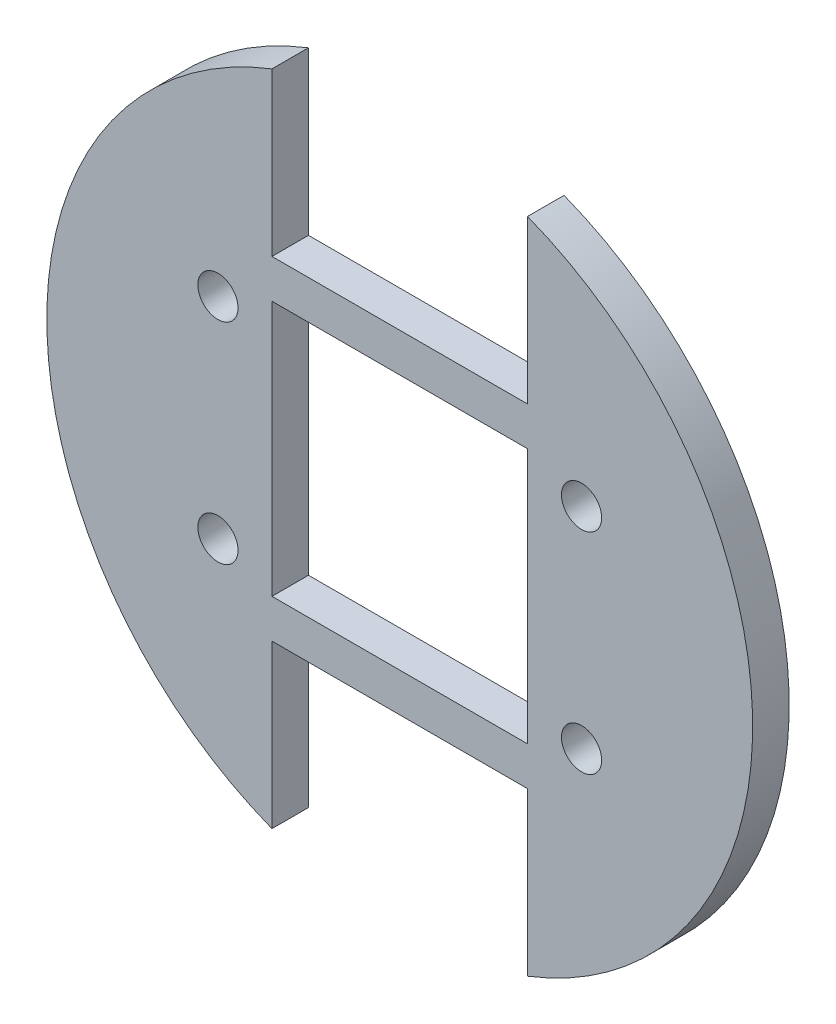
ISO-10303-21;
HEADER;
FILE_DESCRIPTION(('STEP AP214'),'2;1');
FILE_NAME('part.step','',(''),(''),'','','');
FILE_SCHEMA(('AUTOMOTIVE_DESIGN { 1 0 10303 214 1 1 1 1 }'));
ENDSEC;
DATA;
#1=APPLICATION_CONTEXT('core data for automotive mechanical design processes');
#2=APPLICATION_PROTOCOL_DEFINITION('international standard','automotive_design',2000,#1);
#3=PRODUCT_CONTEXT('',#1,'mechanical');
#4=PRODUCT('Part','Part','',(#3));
#5=PRODUCT_RELATED_PRODUCT_CATEGORY('part','',(#4));
#6=PRODUCT_DEFINITION_FORMATION('','',#4);
#7=PRODUCT_DEFINITION_CONTEXT('part definition',#1,'design');
#8=PRODUCT_DEFINITION('design','',#6,#7);
#9=PRODUCT_DEFINITION_SHAPE('','',#8);
#10=(LENGTH_UNIT() NAMED_UNIT(*) SI_UNIT(.MILLI.,.METRE.));
#11=(NAMED_UNIT(*) PLANE_ANGLE_UNIT() SI_UNIT($,.RADIAN.));
#12=(NAMED_UNIT(*) SI_UNIT($,.STERADIAN.) SOLID_ANGLE_UNIT());
#13=UNCERTAINTY_MEASURE_WITH_UNIT(LENGTH_MEASURE(1.E-05),#10,'distance_accuracy_value','');
#14=(GEOMETRIC_REPRESENTATION_CONTEXT(3) GLOBAL_UNCERTAINTY_ASSIGNED_CONTEXT((#13)) GLOBAL_UNIT_ASSIGNED_CONTEXT((#10,
#11,#12)) REPRESENTATION_CONTEXT('',''));
#15=CARTESIAN_POINT('',(0.,0.,0.));
#16=DIRECTION('',(0.,0.,1.));
#17=DIRECTION('',(1.,0.,0.));
#18=AXIS2_PLACEMENT_3D('',#15,#16,#17);
#19=CARTESIAN_POINT('',(0.,0.,3.));
#20=DIRECTION('',(0.,0.,1.));
#21=DIRECTION('',(1.,0.,0.));
#22=AXIS2_PLACEMENT_3D('',#19,#20,#21);
#23=PLANE('',#22);
#24=CARTESIAN_POINT('',(-14.9389382152816,-8.62499999999986,3.));
#25=DIRECTION('',(0.,0.,1.));
#26=DIRECTION('',(1.,0.,0.));
#27=AXIS2_PLACEMENT_3D('',#24,#25,#26);
#28=CIRCLE('',#27,1.65);
#29=CARTESIAN_POINT('',(-13.2889382152816,-8.62499999999986,3.));
#30=VERTEX_POINT('',#29);
#31=EDGE_CURVE('E327',#30,#30,#28,.T.);
#32=ORIENTED_EDGE('',*,*,#31,.F.);
#33=EDGE_LOOP('',(#32));
#34=FACE_BOUND('',#33,.T.);
#35=CARTESIAN_POINT('',(14.9389382152816,8.62499999999997,3.));
#36=DIRECTION('',(0.,0.,1.));
#37=DIRECTION('',(1.,0.,0.));
#38=AXIS2_PLACEMENT_3D('',#35,#36,#37);
#39=CIRCLE('',#38,1.65);
#40=CARTESIAN_POINT('',(16.5889382152816,8.62499999999997,3.));
#41=VERTEX_POINT('',#40);
#42=EDGE_CURVE('E159',#41,#41,#39,.T.);
#43=ORIENTED_EDGE('',*,*,#42,.F.);
#44=EDGE_LOOP('',(#43));
#45=FACE_BOUND('',#44,.T.);
#46=DIRECTION('',(1.,0.,0.));
#47=VECTOR('',#46,1.);
#48=CARTESIAN_POINT('',(-10.5,-13.686215693171,3.));
#49=LINE('',#48,#47);
#50=CARTESIAN_POINT('',(-10.5,-13.686215693171,3.));
#51=VERTEX_POINT('',#50);
#52=CARTESIAN_POINT('',(10.5,-13.686215693171,3.));
#53=VERTEX_POINT('',#52);
#54=EDGE_CURVE('E169',#51,#53,#49,.T.);
#55=ORIENTED_EDGE('',*,*,#54,.T.);
#56=DIRECTION('',(0.,-1.,0.));
#57=VECTOR('',#56,1.);
#58=CARTESIAN_POINT('',(10.5,-13.686215693171,3.));
#59=LINE('',#58,#57);
#60=CARTESIAN_POINT('',(10.5,-27.0323879818265,3.));
#61=VERTEX_POINT('',#60);
#62=EDGE_CURVE('E172',#53,#61,#59,.T.);
#63=ORIENTED_EDGE('',*,*,#62,.T.);
#64=CARTESIAN_POINT('',(0.,0.,3.));
#65=DIRECTION('',(0.,0.,1.));
#66=DIRECTION('',(1.,0.,0.));
#67=AXIS2_PLACEMENT_3D('',#64,#65,#66);
#68=CIRCLE('',#67,29.);
#69=CARTESIAN_POINT('',(10.5,27.0323879818265,3.));
#70=VERTEX_POINT('',#69);
#71=EDGE_CURVE('E175',#61,#70,#68,.T.);
#72=ORIENTED_EDGE('',*,*,#71,.T.);
#73=DIRECTION('',(0.,-1.,0.));
#74=VECTOR('',#73,1.);
#75=CARTESIAN_POINT('',(10.5,13.686215693171,3.));
#76=LINE('',#75,#74);
#77=CARTESIAN_POINT('',(10.5,13.686215693171,3.));
#78=VERTEX_POINT('',#77);
#79=EDGE_CURVE('E177',#70,#78,#76,.T.);
#80=ORIENTED_EDGE('',*,*,#79,.T.);
#81=DIRECTION('',(-1.,0.,0.));
#82=VECTOR('',#81,1.);
#83=CARTESIAN_POINT('',(-10.5,13.686215693171,3.));
#84=LINE('',#83,#82);
#85=CARTESIAN_POINT('',(-10.5,13.686215693171,3.));
#86=VERTEX_POINT('',#85);
#87=EDGE_CURVE('E179',#78,#86,#84,.T.);
#88=ORIENTED_EDGE('',*,*,#87,.T.);
#89=DIRECTION('',(0.,1.,0.));
#90=VECTOR('',#89,1.);
#91=CARTESIAN_POINT('',(-10.5,27.0323879818265,3.));
#92=LINE('',#91,#90);
#93=CARTESIAN_POINT('',(-10.5,27.0323879818265,3.));
#94=VERTEX_POINT('',#93);
#95=EDGE_CURVE('E181',#86,#94,#92,.T.);
#96=ORIENTED_EDGE('',*,*,#95,.T.);
#97=CARTESIAN_POINT('',(0.,0.,3.));
#98=DIRECTION('',(0.,0.,1.));
#99=DIRECTION('',(1.,0.,0.));
#100=AXIS2_PLACEMENT_3D('',#97,#98,#99);
#101=CIRCLE('',#100,29.);
#102=CARTESIAN_POINT('',(-10.5,-27.0323879818265,3.));
#103=VERTEX_POINT('',#102);
#104=EDGE_CURVE('E183',#94,#103,#101,.T.);
#105=ORIENTED_EDGE('',*,*,#104,.T.);
#106=DIRECTION('',(0.,1.,0.));
#107=VECTOR('',#106,1.);
#108=CARTESIAN_POINT('',(-10.5,-27.0323879818265,3.));
#109=LINE('',#108,#107);
#110=EDGE_CURVE('E185',#103,#51,#109,.T.);
#111=ORIENTED_EDGE('',*,*,#110,.T.);
#112=EDGE_LOOP('',(#55,#63,#72,#80,#88,#96,#105,#111));
#113=FACE_BOUND('',#112,.T.);
#114=DIRECTION('',(-1.,0.,0.));
#115=VECTOR('',#114,1.);
#116=CARTESIAN_POINT('',(-10.5,10.5,3.));
#117=LINE('',#116,#115);
#118=CARTESIAN_POINT('',(10.5,10.5,3.));
#119=VERTEX_POINT('',#118);
#120=CARTESIAN_POINT('',(-10.5,10.5,3.));
#121=VERTEX_POINT('',#120);
#122=EDGE_CURVE('E138',#119,#121,#117,.T.);
#123=ORIENTED_EDGE('',*,*,#122,.F.);
#124=DIRECTION('',(0.,1.,0.));
#125=VECTOR('',#124,1.);
#126=CARTESIAN_POINT('',(10.5,10.5,3.));
#127=LINE('',#126,#125);
#128=CARTESIAN_POINT('',(10.5,-10.5,3.));
#129=VERTEX_POINT('',#128);
#130=EDGE_CURVE('E130',#129,#119,#127,.T.);
#131=ORIENTED_EDGE('',*,*,#130,.F.);
#132=DIRECTION('',(1.,0.,0.));
#133=VECTOR('',#132,1.);
#134=CARTESIAN_POINT('',(-10.5,-10.5,3.));
#135=LINE('',#134,#133);
#136=CARTESIAN_POINT('',(-10.5,-10.5,3.));
#137=VERTEX_POINT('',#136);
#138=EDGE_CURVE('E153',#137,#129,#135,.T.);
#139=ORIENTED_EDGE('',*,*,#138,.F.);
#140=DIRECTION('',(0.,-1.,0.));
#141=VECTOR('',#140,1.);
#142=CARTESIAN_POINT('',(-10.5,10.5,3.));
#143=LINE('',#142,#141);
#144=EDGE_CURVE('E151',#121,#137,#143,.T.);
#145=ORIENTED_EDGE('',*,*,#144,.F.);
#146=EDGE_LOOP('',(#123,#131,#139,#145));
#147=FACE_BOUND('',#146,.T.);
#148=CARTESIAN_POINT('',(14.9389382152815,-8.62500000000007,3.));
#149=DIRECTION('',(0.,0.,1.));
#150=DIRECTION('',(1.,0.,0.));
#151=AXIS2_PLACEMENT_3D('',#148,#149,#150);
#152=CIRCLE('',#151,1.65);
#153=CARTESIAN_POINT('',(16.5889382152815,-8.62500000000007,3.));
#154=VERTEX_POINT('',#153);
#155=EDGE_CURVE('E333',#154,#154,#152,.T.);
#156=ORIENTED_EDGE('',*,*,#155,.F.);
#157=EDGE_LOOP('',(#156));
#158=FACE_BOUND('',#157,.T.);
#159=CARTESIAN_POINT('',(-14.9389382152815,8.62500000000018,3.));
#160=DIRECTION('',(0.,0.,1.));
#161=DIRECTION('',(1.,0.,0.));
#162=AXIS2_PLACEMENT_3D('',#159,#160,#161);
#163=CIRCLE('',#162,1.65);
#164=CARTESIAN_POINT('',(-13.2889382152815,8.62500000000018,3.));
#165=VERTEX_POINT('',#164);
#166=EDGE_CURVE('E318',#165,#165,#163,.T.);
#167=ORIENTED_EDGE('',*,*,#166,.F.);
#168=EDGE_LOOP('',(#167));
#169=FACE_BOUND('',#168,.T.);
#170=ADVANCED_FACE('F41',(#34,#45,#113,#147,#158,#169),#23,.T.);
#171=CARTESIAN_POINT('',(0.,0.,0.));
#172=DIRECTION('',(0.,0.,1.));
#173=DIRECTION('',(1.,0.,0.));
#174=AXIS2_PLACEMENT_3D('',#171,#172,#173);
#175=PLANE('',#174);
#176=DIRECTION('',(1.,0.,0.));
#177=VECTOR('',#176,1.);
#178=CARTESIAN_POINT('',(-10.5,-13.686215693171,0.));
#179=LINE('',#178,#177);
#180=CARTESIAN_POINT('',(-10.5,-13.686215693171,0.));
#181=VERTEX_POINT('',#180);
#182=CARTESIAN_POINT('',(10.5,-13.686215693171,0.));
#183=VERTEX_POINT('',#182);
#184=EDGE_CURVE('E146',#181,#183,#179,.T.);
#185=ORIENTED_EDGE('',*,*,#184,.F.);
#186=DIRECTION('',(0.,1.,0.));
#187=VECTOR('',#186,1.);
#188=CARTESIAN_POINT('',(-10.5,-27.0323879818265,0.));
#189=LINE('',#188,#187);
#190=CARTESIAN_POINT('',(-10.5,-27.0323879818265,0.));
#191=VERTEX_POINT('',#190);
#192=EDGE_CURVE('E173',#191,#181,#189,.T.);
#193=ORIENTED_EDGE('',*,*,#192,.F.);
#194=CARTESIAN_POINT('',(0.,0.,0.));
#195=DIRECTION('',(0.,0.,1.));
#196=DIRECTION('',(1.,0.,0.));
#197=AXIS2_PLACEMENT_3D('',#194,#195,#196);
#198=CIRCLE('',#197,29.);
#199=CARTESIAN_POINT('',(-10.5,27.0323879818265,0.));
#200=VERTEX_POINT('',#199);
#201=EDGE_CURVE('E200',#200,#191,#198,.T.);
#202=ORIENTED_EDGE('',*,*,#201,.F.);
#203=DIRECTION('',(0.,1.,0.));
#204=VECTOR('',#203,1.);
#205=CARTESIAN_POINT('',(-10.5,27.0323879818265,0.));
#206=LINE('',#205,#204);
#207=CARTESIAN_POINT('',(-10.5,13.686215693171,0.));
#208=VERTEX_POINT('',#207);
#209=EDGE_CURVE('E198',#208,#200,#206,.T.);
#210=ORIENTED_EDGE('',*,*,#209,.F.);
#211=DIRECTION('',(-1.,0.,0.));
#212=VECTOR('',#211,1.);
#213=CARTESIAN_POINT('',(-10.5,13.686215693171,0.));
#214=LINE('',#213,#212);
#215=CARTESIAN_POINT('',(10.5,13.686215693171,0.));
#216=VERTEX_POINT('',#215);
#217=EDGE_CURVE('E196',#216,#208,#214,.T.);
#218=ORIENTED_EDGE('',*,*,#217,.F.);
#219=DIRECTION('',(0.,-1.,0.));
#220=VECTOR('',#219,1.);
#221=CARTESIAN_POINT('',(10.5,13.686215693171,0.));
#222=LINE('',#221,#220);
#223=CARTESIAN_POINT('',(10.5,27.0323879818265,0.));
#224=VERTEX_POINT('',#223);
#225=EDGE_CURVE('E194',#224,#216,#222,.T.);
#226=ORIENTED_EDGE('',*,*,#225,.F.);
#227=CARTESIAN_POINT('',(0.,0.,0.));
#228=DIRECTION('',(0.,0.,1.));
#229=DIRECTION('',(1.,0.,0.));
#230=AXIS2_PLACEMENT_3D('',#227,#228,#229);
#231=CIRCLE('',#230,29.);
#232=CARTESIAN_POINT('',(10.5,-27.0323879818265,0.));
#233=VERTEX_POINT('',#232);
#234=EDGE_CURVE('E192',#233,#224,#231,.T.);
#235=ORIENTED_EDGE('',*,*,#234,.F.);
#236=DIRECTION('',(0.,-1.,0.));
#237=VECTOR('',#236,1.);
#238=CARTESIAN_POINT('',(10.5,-13.686215693171,0.));
#239=LINE('',#238,#237);
#240=EDGE_CURVE('E190',#183,#233,#239,.T.);
#241=ORIENTED_EDGE('',*,*,#240,.F.);
#242=EDGE_LOOP('',(#185,#193,#202,#210,#218,#226,#235,#241));
#243=FACE_BOUND('',#242,.T.);
#244=DIRECTION('',(0.,1.,0.));
#245=VECTOR('',#244,1.);
#246=CARTESIAN_POINT('',(10.5,10.5,0.));
#247=LINE('',#246,#245);
#248=CARTESIAN_POINT('',(10.5,-10.5,0.));
#249=VERTEX_POINT('',#248);
#250=CARTESIAN_POINT('',(10.5,10.5,0.));
#251=VERTEX_POINT('',#250);
#252=EDGE_CURVE('E64',#249,#251,#247,.T.);
#253=ORIENTED_EDGE('',*,*,#252,.T.);
#254=DIRECTION('',(-1.,0.,0.));
#255=VECTOR('',#254,1.);
#256=CARTESIAN_POINT('',(-10.5,10.5,0.));
#257=LINE('',#256,#255);
#258=CARTESIAN_POINT('',(-10.5,10.5,0.));
#259=VERTEX_POINT('',#258);
#260=EDGE_CURVE('E145',#251,#259,#257,.T.);
#261=ORIENTED_EDGE('',*,*,#260,.T.);
#262=DIRECTION('',(0.,-1.,0.));
#263=VECTOR('',#262,1.);
#264=CARTESIAN_POINT('',(-10.5,10.5,0.));
#265=LINE('',#264,#263);
#266=CARTESIAN_POINT('',(-10.5,-10.5,0.));
#267=VERTEX_POINT('',#266);
#268=EDGE_CURVE('E161',#259,#267,#265,.T.);
#269=ORIENTED_EDGE('',*,*,#268,.T.);
#270=DIRECTION('',(1.,0.,0.));
#271=VECTOR('',#270,1.);
#272=CARTESIAN_POINT('',(-10.5,-10.5,0.));
#273=LINE('',#272,#271);
#274=EDGE_CURVE('E139',#267,#249,#273,.T.);
#275=ORIENTED_EDGE('',*,*,#274,.T.);
#276=EDGE_LOOP('',(#253,#261,#269,#275));
#277=FACE_BOUND('',#276,.T.);
#278=CARTESIAN_POINT('',(14.9389382152816,8.62499999999997,0.));
#279=DIRECTION('',(0.,0.,1.));
#280=DIRECTION('',(1.,0.,0.));
#281=AXIS2_PLACEMENT_3D('',#278,#279,#280);
#282=CIRCLE('',#281,1.65);
#283=CARTESIAN_POINT('',(16.5889382152816,8.62499999999997,0.));
#284=VERTEX_POINT('',#283);
#285=EDGE_CURVE('E336',#284,#284,#282,.T.);
#286=ORIENTED_EDGE('',*,*,#285,.T.);
#287=EDGE_LOOP('',(#286));
#288=FACE_BOUND('',#287,.T.);
#289=CARTESIAN_POINT('',(14.9389382152815,-8.62500000000007,0.));
#290=DIRECTION('',(0.,0.,1.));
#291=DIRECTION('',(1.,0.,0.));
#292=AXIS2_PLACEMENT_3D('',#289,#290,#291);
#293=CIRCLE('',#292,1.65);
#294=CARTESIAN_POINT('',(16.5889382152815,-8.62500000000007,0.));
#295=VERTEX_POINT('',#294);
#296=EDGE_CURVE('E330',#295,#295,#293,.T.);
#297=ORIENTED_EDGE('',*,*,#296,.T.);
#298=EDGE_LOOP('',(#297));
#299=FACE_BOUND('',#298,.T.);
#300=CARTESIAN_POINT('',(-14.9389382152816,-8.62499999999986,0.));
#301=DIRECTION('',(0.,0.,1.));
#302=DIRECTION('',(1.,0.,0.));
#303=AXIS2_PLACEMENT_3D('',#300,#301,#302);
#304=CIRCLE('',#303,1.65);
#305=CARTESIAN_POINT('',(-13.2889382152816,-8.62499999999986,0.));
#306=VERTEX_POINT('',#305);
#307=EDGE_CURVE('E324',#306,#306,#304,.T.);
#308=ORIENTED_EDGE('',*,*,#307,.T.);
#309=EDGE_LOOP('',(#308));
#310=FACE_BOUND('',#309,.T.);
#311=CARTESIAN_POINT('',(-14.9389382152815,8.62500000000018,0.));
#312=DIRECTION('',(0.,0.,1.));
#313=DIRECTION('',(1.,0.,0.));
#314=AXIS2_PLACEMENT_3D('',#311,#312,#313);
#315=CIRCLE('',#314,1.65);
#316=CARTESIAN_POINT('',(-13.2889382152815,8.62500000000018,0.));
#317=VERTEX_POINT('',#316);
#318=EDGE_CURVE('E321',#317,#317,#315,.T.);
#319=ORIENTED_EDGE('',*,*,#318,.T.);
#320=EDGE_LOOP('',(#319));
#321=FACE_BOUND('',#320,.T.);
#322=ADVANCED_FACE('F230',(#243,#277,#288,#299,#310,#321),#175,.F.);
#323=CARTESIAN_POINT('',(-10.5,-13.686215693171,3.));
#324=DIRECTION('',(0.,1.,0.));
#325=DIRECTION('',(0.,0.,1.));
#326=AXIS2_PLACEMENT_3D('',#323,#324,#325);
#327=PLANE('',#326);
#328=ORIENTED_EDGE('',*,*,#184,.T.);
#329=DIRECTION('',(0.,0.,-1.));
#330=VECTOR('',#329,1.);
#331=CARTESIAN_POINT('',(10.5,-13.686215693171,3.));
#332=LINE('',#331,#330);
#333=EDGE_CURVE('E11',#53,#183,#332,.T.);
#334=ORIENTED_EDGE('',*,*,#333,.F.);
#335=ORIENTED_EDGE('',*,*,#54,.F.);
#336=DIRECTION('',(0.,0.,-1.));
#337=VECTOR('',#336,1.);
#338=CARTESIAN_POINT('',(-10.5,-13.686215693171,3.));
#339=LINE('',#338,#337);
#340=EDGE_CURVE('E187',#51,#181,#339,.T.);
#341=ORIENTED_EDGE('',*,*,#340,.T.);
#342=EDGE_LOOP('',(#328,#334,#335,#341));
#343=FACE_BOUND('',#342,.T.);
#344=ADVANCED_FACE('F43',(#343),#327,.F.);
#345=CARTESIAN_POINT('',(10.5,-13.686215693171,3.));
#346=DIRECTION('',(1.,0.,0.));
#347=DIRECTION('',(0.,0.,-1.));
#348=AXIS2_PLACEMENT_3D('',#345,#346,#347);
#349=PLANE('',#348);
#350=ORIENTED_EDGE('',*,*,#240,.T.);
#351=DIRECTION('',(0.,0.,-1.));
#352=VECTOR('',#351,1.);
#353=CARTESIAN_POINT('',(10.5,-27.0323879818265,3.));
#354=LINE('',#353,#352);
#355=EDGE_CURVE('E49',#61,#233,#354,.T.);
#356=ORIENTED_EDGE('',*,*,#355,.F.);
#357=ORIENTED_EDGE('',*,*,#62,.F.);
#358=ORIENTED_EDGE('',*,*,#333,.T.);
#359=EDGE_LOOP('',(#350,#356,#357,#358));
#360=FACE_BOUND('',#359,.T.);
#361=ADVANCED_FACE('F247',(#360),#349,.F.);
#362=CARTESIAN_POINT('',(0.,0.,3.));
#363=DIRECTION('',(0.,0.,-1.));
#364=DIRECTION('',(-1.,0.,0.));
#365=AXIS2_PLACEMENT_3D('',#362,#363,#364);
#366=CYLINDRICAL_SURFACE('',#365,29.);
#367=ORIENTED_EDGE('',*,*,#234,.T.);
#368=DIRECTION('',(0.,0.,-1.));
#369=VECTOR('',#368,1.);
#370=CARTESIAN_POINT('',(10.5,27.0323879818265,3.));
#371=LINE('',#370,#369);
#372=EDGE_CURVE('E217',#70,#224,#371,.T.);
#373=ORIENTED_EDGE('',*,*,#372,.F.);
#374=ORIENTED_EDGE('',*,*,#71,.F.);
#375=ORIENTED_EDGE('',*,*,#355,.T.);
#376=EDGE_LOOP('',(#367,#373,#374,#375));
#377=FACE_BOUND('',#376,.T.);
#378=ADVANCED_FACE('F224',(#377),#366,.T.);
#379=CARTESIAN_POINT('',(10.5,13.686215693171,3.));
#380=DIRECTION('',(1.,0.,0.));
#381=DIRECTION('',(0.,0.,-1.));
#382=AXIS2_PLACEMENT_3D('',#379,#380,#381);
#383=PLANE('',#382);
#384=ORIENTED_EDGE('',*,*,#225,.T.);
#385=DIRECTION('',(0.,0.,-1.));
#386=VECTOR('',#385,1.);
#387=CARTESIAN_POINT('',(10.5,13.686215693171,3.));
#388=LINE('',#387,#386);
#389=EDGE_CURVE('E214',#78,#216,#388,.T.);
#390=ORIENTED_EDGE('',*,*,#389,.F.);
#391=ORIENTED_EDGE('',*,*,#79,.F.);
#392=ORIENTED_EDGE('',*,*,#372,.T.);
#393=EDGE_LOOP('',(#384,#390,#391,#392));
#394=FACE_BOUND('',#393,.T.);
#395=ADVANCED_FACE('F236',(#394),#383,.F.);
#396=CARTESIAN_POINT('',(-10.5,13.686215693171,3.));
#397=DIRECTION('',(0.,-1.,0.));
#398=DIRECTION('',(0.,0.,-1.));
#399=AXIS2_PLACEMENT_3D('',#396,#397,#398);
#400=PLANE('',#399);
#401=ORIENTED_EDGE('',*,*,#217,.T.);
#402=DIRECTION('',(0.,0.,-1.));
#403=VECTOR('',#402,1.);
#404=CARTESIAN_POINT('',(-10.5,13.686215693171,3.));
#405=LINE('',#404,#403);
#406=EDGE_CURVE('E211',#86,#208,#405,.T.);
#407=ORIENTED_EDGE('',*,*,#406,.F.);
#408=ORIENTED_EDGE('',*,*,#87,.F.);
#409=ORIENTED_EDGE('',*,*,#389,.T.);
#410=EDGE_LOOP('',(#401,#407,#408,#409));
#411=FACE_BOUND('',#410,.T.);
#412=ADVANCED_FACE('F240',(#411),#400,.F.);
#413=CARTESIAN_POINT('',(-10.5,27.0323879818265,3.));
#414=DIRECTION('',(-1.,0.,0.));
#415=DIRECTION('',(0.,0.,1.));
#416=AXIS2_PLACEMENT_3D('',#413,#414,#415);
#417=PLANE('',#416);
#418=ORIENTED_EDGE('',*,*,#209,.T.);
#419=DIRECTION('',(0.,0.,-1.));
#420=VECTOR('',#419,1.);
#421=CARTESIAN_POINT('',(-10.5,27.0323879818265,3.));
#422=LINE('',#421,#420);
#423=EDGE_CURVE('E208',#94,#200,#422,.T.);
#424=ORIENTED_EDGE('',*,*,#423,.F.);
#425=ORIENTED_EDGE('',*,*,#95,.F.);
#426=ORIENTED_EDGE('',*,*,#406,.T.);
#427=EDGE_LOOP('',(#418,#424,#425,#426));
#428=FACE_BOUND('',#427,.T.);
#429=ADVANCED_FACE('F260',(#428),#417,.F.);
#430=CARTESIAN_POINT('',(0.,0.,3.));
#431=DIRECTION('',(0.,0.,-1.));
#432=DIRECTION('',(-1.,0.,0.));
#433=AXIS2_PLACEMENT_3D('',#430,#431,#432);
#434=CYLINDRICAL_SURFACE('',#433,29.);
#435=ORIENTED_EDGE('',*,*,#201,.T.);
#436=DIRECTION('',(0.,0.,-1.));
#437=VECTOR('',#436,1.);
#438=CARTESIAN_POINT('',(-10.5,-27.0323879818265,3.));
#439=LINE('',#438,#437);
#440=EDGE_CURVE('E205',#103,#191,#439,.T.);
#441=ORIENTED_EDGE('',*,*,#440,.F.);
#442=ORIENTED_EDGE('',*,*,#104,.F.);
#443=ORIENTED_EDGE('',*,*,#423,.T.);
#444=EDGE_LOOP('',(#435,#441,#442,#443));
#445=FACE_BOUND('',#444,.T.);
#446=ADVANCED_FACE('F258',(#445),#434,.T.);
#447=CARTESIAN_POINT('',(-10.5,-27.0323879818265,3.));
#448=DIRECTION('',(-1.,0.,0.));
#449=DIRECTION('',(0.,0.,1.));
#450=AXIS2_PLACEMENT_3D('',#447,#448,#449);
#451=PLANE('',#450);
#452=ORIENTED_EDGE('',*,*,#192,.T.);
#453=ORIENTED_EDGE('',*,*,#340,.F.);
#454=ORIENTED_EDGE('',*,*,#110,.F.);
#455=ORIENTED_EDGE('',*,*,#440,.T.);
#456=EDGE_LOOP('',(#452,#453,#454,#455));
#457=FACE_BOUND('',#456,.T.);
#458=ADVANCED_FACE('F253',(#457),#451,.F.);
#459=CARTESIAN_POINT('',(10.5,10.5,3.));
#460=DIRECTION('',(-1.,0.,0.));
#461=DIRECTION('',(0.,-1.,0.));
#462=AXIS2_PLACEMENT_3D('',#459,#460,#461);
#463=PLANE('',#462);
#464=ORIENTED_EDGE('',*,*,#252,.F.);
#465=DIRECTION('',(0.,0.,-1.));
#466=VECTOR('',#465,1.);
#467=CARTESIAN_POINT('',(10.5,-10.5,3.));
#468=LINE('',#467,#466);
#469=EDGE_CURVE('E134',#129,#249,#468,.T.);
#470=ORIENTED_EDGE('',*,*,#469,.F.);
#471=ORIENTED_EDGE('',*,*,#130,.T.);
#472=DIRECTION('',(0.,0.,-1.));
#473=VECTOR('',#472,1.);
#474=CARTESIAN_POINT('',(10.5,10.5,3.));
#475=LINE('',#474,#473);
#476=EDGE_CURVE('E133',#119,#251,#475,.T.);
#477=ORIENTED_EDGE('',*,*,#476,.T.);
#478=EDGE_LOOP('',(#464,#470,#471,#477));
#479=FACE_BOUND('',#478,.T.);
#480=ADVANCED_FACE('F132',(#479),#463,.T.);
#481=CARTESIAN_POINT('',(-10.5,10.5,3.));
#482=DIRECTION('',(0.,-1.,0.));
#483=DIRECTION('',(0.,0.,-1.));
#484=AXIS2_PLACEMENT_3D('',#481,#482,#483);
#485=PLANE('',#484);
#486=ORIENTED_EDGE('',*,*,#260,.F.);
#487=ORIENTED_EDGE('',*,*,#476,.F.);
#488=ORIENTED_EDGE('',*,*,#122,.T.);
#489=DIRECTION('',(0.,0.,-1.));
#490=VECTOR('',#489,1.);
#491=CARTESIAN_POINT('',(-10.5,10.5,3.));
#492=LINE('',#491,#490);
#493=EDGE_CURVE('E147',#121,#259,#492,.T.);
#494=ORIENTED_EDGE('',*,*,#493,.T.);
#495=EDGE_LOOP('',(#486,#487,#488,#494));
#496=FACE_BOUND('',#495,.T.);
#497=ADVANCED_FACE('F142',(#496),#485,.T.);
#498=CARTESIAN_POINT('',(-10.5,10.5,3.));
#499=DIRECTION('',(1.,0.,0.));
#500=DIRECTION('',(0.,1.,0.));
#501=AXIS2_PLACEMENT_3D('',#498,#499,#500);
#502=PLANE('',#501);
#503=ORIENTED_EDGE('',*,*,#268,.F.);
#504=ORIENTED_EDGE('',*,*,#493,.F.);
#505=ORIENTED_EDGE('',*,*,#144,.T.);
#506=DIRECTION('',(0.,0.,-1.));
#507=VECTOR('',#506,1.);
#508=CARTESIAN_POINT('',(-10.5,-10.5,3.));
#509=LINE('',#508,#507);
#510=EDGE_CURVE('E56',#137,#267,#509,.T.);
#511=ORIENTED_EDGE('',*,*,#510,.T.);
#512=EDGE_LOOP('',(#503,#504,#505,#511));
#513=FACE_BOUND('',#512,.T.);
#514=ADVANCED_FACE('F288',(#513),#502,.T.);
#515=CARTESIAN_POINT('',(-10.5,-10.5,3.));
#516=DIRECTION('',(0.,1.,0.));
#517=DIRECTION('',(0.,0.,1.));
#518=AXIS2_PLACEMENT_3D('',#515,#516,#517);
#519=PLANE('',#518);
#520=ORIENTED_EDGE('',*,*,#274,.F.);
#521=ORIENTED_EDGE('',*,*,#510,.F.);
#522=ORIENTED_EDGE('',*,*,#138,.T.);
#523=ORIENTED_EDGE('',*,*,#469,.T.);
#524=EDGE_LOOP('',(#520,#521,#522,#523));
#525=FACE_BOUND('',#524,.T.);
#526=ADVANCED_FACE('F292',(#525),#519,.T.);
#527=CARTESIAN_POINT('',(14.9389382152816,8.62499999999997,3.));
#528=DIRECTION('',(0.,0.,-1.));
#529=DIRECTION('',(-1.,0.,0.));
#530=AXIS2_PLACEMENT_3D('',#527,#528,#529);
#531=CYLINDRICAL_SURFACE('',#530,1.65);
#532=ORIENTED_EDGE('',*,*,#42,.T.);
#533=EDGE_LOOP('',(#532));
#534=FACE_BOUND('',#533,.T.);
#535=ORIENTED_EDGE('',*,*,#285,.F.);
#536=EDGE_LOOP('',(#535));
#537=FACE_BOUND('',#536,.T.);
#538=ADVANCED_FACE('F298',(#534,#537),#531,.F.);
#539=CARTESIAN_POINT('',(14.9389382152815,-8.62500000000007,3.));
#540=DIRECTION('',(0.,0.,-1.));
#541=DIRECTION('',(-1.,0.,0.));
#542=AXIS2_PLACEMENT_3D('',#539,#540,#541);
#543=CYLINDRICAL_SURFACE('',#542,1.65);
#544=ORIENTED_EDGE('',*,*,#155,.T.);
#545=EDGE_LOOP('',(#544));
#546=FACE_BOUND('',#545,.T.);
#547=ORIENTED_EDGE('',*,*,#296,.F.);
#548=EDGE_LOOP('',(#547));
#549=FACE_BOUND('',#548,.T.);
#550=ADVANCED_FACE('F301',(#546,#549),#543,.F.);
#551=CARTESIAN_POINT('',(-14.9389382152816,-8.62499999999986,3.));
#552=DIRECTION('',(0.,0.,-1.));
#553=DIRECTION('',(-1.,0.,0.));
#554=AXIS2_PLACEMENT_3D('',#551,#552,#553);
#555=CYLINDRICAL_SURFACE('',#554,1.65);
#556=ORIENTED_EDGE('',*,*,#31,.T.);
#557=EDGE_LOOP('',(#556));
#558=FACE_BOUND('',#557,.T.);
#559=ORIENTED_EDGE('',*,*,#307,.F.);
#560=EDGE_LOOP('',(#559));
#561=FACE_BOUND('',#560,.T.);
#562=ADVANCED_FACE('F305',(#558,#561),#555,.F.);
#563=CARTESIAN_POINT('',(-14.9389382152815,8.62500000000018,3.));
#564=DIRECTION('',(0.,0.,-1.));
#565=DIRECTION('',(-1.,0.,0.));
#566=AXIS2_PLACEMENT_3D('',#563,#564,#565);
#567=CYLINDRICAL_SURFACE('',#566,1.65);
#568=ORIENTED_EDGE('',*,*,#166,.T.);
#569=EDGE_LOOP('',(#568));
#570=FACE_BOUND('',#569,.T.);
#571=ORIENTED_EDGE('',*,*,#318,.F.);
#572=EDGE_LOOP('',(#571));
#573=FACE_BOUND('',#572,.T.);
#574=ADVANCED_FACE('F309',(#570,#573),#567,.F.);
#575=CLOSED_SHELL('',(#170,#322,#344,#361,#378,#395,#412,#429,#446,#458,#480,#497,#514,#526,
#538,#550,#562,#574));
#576=MANIFOLD_SOLID_BREP('B2',#575);
#577=ADVANCED_BREP_SHAPE_REPRESENTATION('',(#18,#576),#14);
#578=SHAPE_DEFINITION_REPRESENTATION(#9,#577);
ENDSEC;
END-ISO-10303-21;
